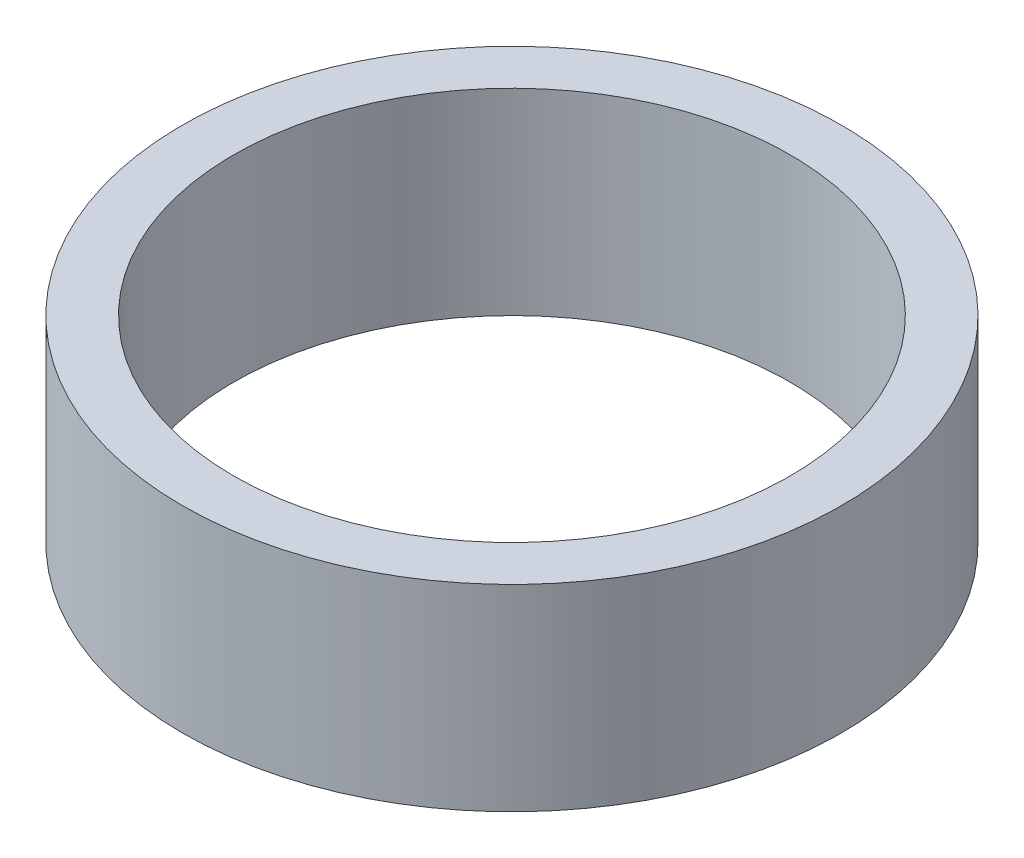
ISO-10303-21;
HEADER;
FILE_DESCRIPTION(('STEP AP214'),'2;1');
FILE_NAME('part.step','',(''),(''),'','','');
FILE_SCHEMA(('AUTOMOTIVE_DESIGN { 1 0 10303 214 1 1 1 1 }'));
ENDSEC;
DATA;
#1=APPLICATION_CONTEXT('core data for automotive mechanical design processes');
#2=APPLICATION_PROTOCOL_DEFINITION('international standard','automotive_design',2000,#1);
#3=PRODUCT_CONTEXT('',#1,'mechanical');
#4=PRODUCT('Part','Part','',(#3));
#5=PRODUCT_RELATED_PRODUCT_CATEGORY('part','',(#4));
#6=PRODUCT_DEFINITION_FORMATION('','',#4);
#7=PRODUCT_DEFINITION_CONTEXT('part definition',#1,'design');
#8=PRODUCT_DEFINITION('design','',#6,#7);
#9=PRODUCT_DEFINITION_SHAPE('','',#8);
#10=(LENGTH_UNIT() NAMED_UNIT(*) SI_UNIT(.MILLI.,.METRE.));
#11=(NAMED_UNIT(*) PLANE_ANGLE_UNIT() SI_UNIT($,.RADIAN.));
#12=(NAMED_UNIT(*) SI_UNIT($,.STERADIAN.) SOLID_ANGLE_UNIT());
#13=UNCERTAINTY_MEASURE_WITH_UNIT(LENGTH_MEASURE(1.E-05),#10,'distance_accuracy_value','');
#14=(GEOMETRIC_REPRESENTATION_CONTEXT(3) GLOBAL_UNCERTAINTY_ASSIGNED_CONTEXT((#13)) GLOBAL_UNIT_ASSIGNED_CONTEXT((#10,
#11,#12)) REPRESENTATION_CONTEXT('',''));
#15=CARTESIAN_POINT('',(0.,0.,0.));
#16=DIRECTION('',(0.,0.,1.));
#17=DIRECTION('',(1.,0.,0.));
#18=AXIS2_PLACEMENT_3D('',#15,#16,#17);
#19=CARTESIAN_POINT('',(0.,2.3,0.));
#20=DIRECTION('',(0.,1.,0.));
#21=DIRECTION('',(0.,0.,1.));
#22=AXIS2_PLACEMENT_3D('',#19,#20,#21);
#23=PLANE('',#22);
#24=CARTESIAN_POINT('',(0.,2.3,0.));
#25=DIRECTION('',(0.,1.,0.));
#26=DIRECTION('',(0.,0.,1.));
#27=AXIS2_PLACEMENT_3D('',#24,#25,#26);
#28=CIRCLE('',#27,3.85);
#29=CARTESIAN_POINT('',(0.,2.3,3.85));
#30=VERTEX_POINT('',#29);
#31=EDGE_CURVE('E11',#30,#30,#28,.T.);
#32=ORIENTED_EDGE('',*,*,#31,.T.);
#33=EDGE_LOOP('',(#32));
#34=FACE_BOUND('',#33,.T.);
#35=CARTESIAN_POINT('',(0.,2.3,0.));
#36=DIRECTION('',(0.,1.,0.));
#37=DIRECTION('',(0.,0.,1.));
#38=AXIS2_PLACEMENT_3D('',#35,#36,#37);
#39=CIRCLE('',#38,3.25);
#40=CARTESIAN_POINT('',(0.,2.3,3.25));
#41=VERTEX_POINT('',#40);
#42=EDGE_CURVE('E56',#41,#41,#39,.T.);
#43=ORIENTED_EDGE('',*,*,#42,.F.);
#44=EDGE_LOOP('',(#43));
#45=FACE_BOUND('',#44,.T.);
#46=ADVANCED_FACE('F43',(#34,#45),#23,.T.);
#47=CARTESIAN_POINT('',(0.,0.,0.));
#48=DIRECTION('',(0.,1.,0.));
#49=DIRECTION('',(0.,0.,1.));
#50=AXIS2_PLACEMENT_3D('',#47,#48,#49);
#51=PLANE('',#50);
#52=CARTESIAN_POINT('',(0.,0.,0.));
#53=DIRECTION('',(0.,1.,0.));
#54=DIRECTION('',(0.,0.,1.));
#55=AXIS2_PLACEMENT_3D('',#52,#53,#54);
#56=CIRCLE('',#55,3.85);
#57=CARTESIAN_POINT('',(0.,0.,3.85));
#58=VERTEX_POINT('',#57);
#59=EDGE_CURVE('E47',#58,#58,#56,.T.);
#60=ORIENTED_EDGE('',*,*,#59,.F.);
#61=EDGE_LOOP('',(#60));
#62=FACE_BOUND('',#61,.T.);
#63=CARTESIAN_POINT('',(0.,0.,0.));
#64=DIRECTION('',(0.,1.,0.));
#65=DIRECTION('',(0.,0.,1.));
#66=AXIS2_PLACEMENT_3D('',#63,#64,#65);
#67=CIRCLE('',#66,3.25);
#68=CARTESIAN_POINT('',(0.,0.,3.25));
#69=VERTEX_POINT('',#68);
#70=EDGE_CURVE('E58',#69,#69,#67,.T.);
#71=ORIENTED_EDGE('',*,*,#70,.T.);
#72=EDGE_LOOP('',(#71));
#73=FACE_BOUND('',#72,.T.);
#74=ADVANCED_FACE('F70',(#62,#73),#51,.F.);
#75=CARTESIAN_POINT('',(0.,2.3,0.));
#76=DIRECTION('',(0.,-1.,0.));
#77=DIRECTION('',(0.,0.,-1.));
#78=AXIS2_PLACEMENT_3D('',#75,#76,#77);
#79=CYLINDRICAL_SURFACE('',#78,3.85);
#80=ORIENTED_EDGE('',*,*,#31,.F.);
#81=EDGE_LOOP('',(#80));
#82=FACE_BOUND('',#81,.T.);
#83=ORIENTED_EDGE('',*,*,#59,.T.);
#84=EDGE_LOOP('',(#83));
#85=FACE_BOUND('',#84,.T.);
#86=ADVANCED_FACE('F45',(#82,#85),#79,.T.);
#87=CARTESIAN_POINT('',(0.,2.3,0.));
#88=DIRECTION('',(0.,-1.,0.));
#89=DIRECTION('',(0.,0.,-1.));
#90=AXIS2_PLACEMENT_3D('',#87,#88,#89);
#91=CYLINDRICAL_SURFACE('',#90,3.25);
#92=ORIENTED_EDGE('',*,*,#42,.T.);
#93=EDGE_LOOP('',(#92));
#94=FACE_BOUND('',#93,.T.);
#95=ORIENTED_EDGE('',*,*,#70,.F.);
#96=EDGE_LOOP('',(#95));
#97=FACE_BOUND('',#96,.T.);
#98=ADVANCED_FACE('F66',(#94,#97),#91,.F.);
#99=CLOSED_SHELL('',(#46,#74,#86,#98));
#100=MANIFOLD_SOLID_BREP('B2',#99);
#101=ADVANCED_BREP_SHAPE_REPRESENTATION('',(#18,#100),#14);
#102=SHAPE_DEFINITION_REPRESENTATION(#9,#101);
ENDSEC;
END-ISO-10303-21;
